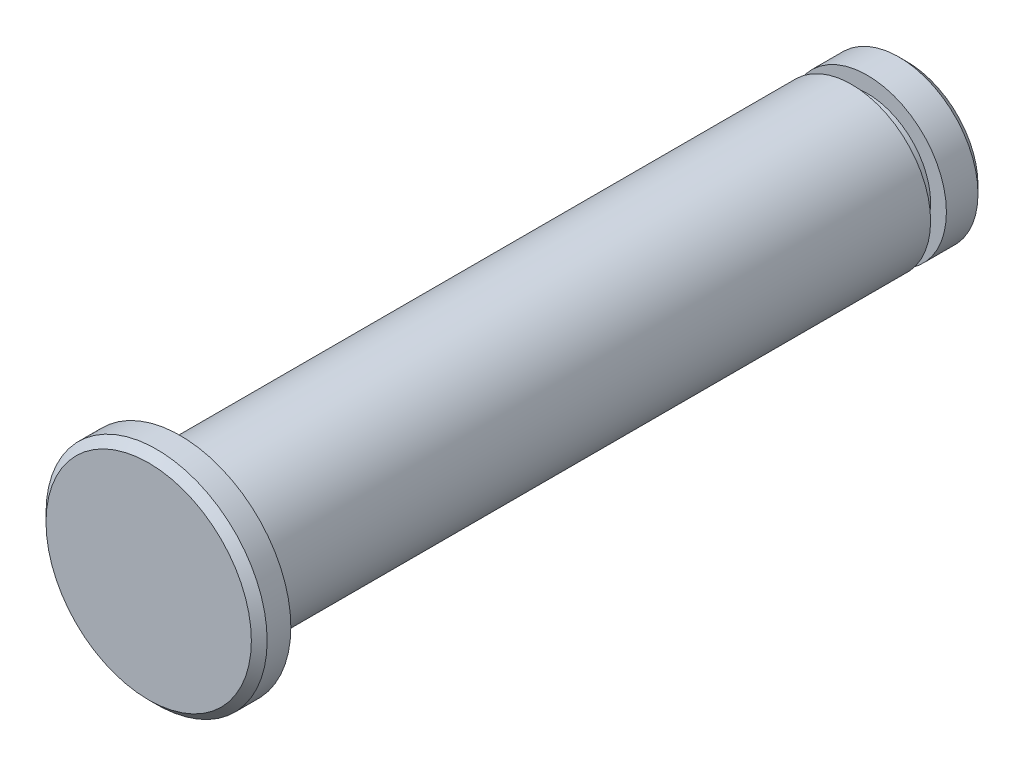
ISO-10303-21;
HEADER;
FILE_DESCRIPTION(('STEP AP214'),'2;1');
FILE_NAME('part.step','',(''),(''),'','','');
FILE_SCHEMA(('AUTOMOTIVE_DESIGN { 1 0 10303 214 1 1 1 1 }'));
ENDSEC;
DATA;
#1=APPLICATION_CONTEXT('core data for automotive mechanical design processes');
#2=APPLICATION_PROTOCOL_DEFINITION('international standard','automotive_design',2000,#1);
#3=PRODUCT_CONTEXT('',#1,'mechanical');
#4=PRODUCT('Part','Part','',(#3));
#5=PRODUCT_RELATED_PRODUCT_CATEGORY('part','',(#4));
#6=PRODUCT_DEFINITION_FORMATION('','',#4);
#7=PRODUCT_DEFINITION_CONTEXT('part definition',#1,'design');
#8=PRODUCT_DEFINITION('design','',#6,#7);
#9=PRODUCT_DEFINITION_SHAPE('','',#8);
#10=(LENGTH_UNIT() NAMED_UNIT(*) SI_UNIT(.MILLI.,.METRE.));
#11=(NAMED_UNIT(*) PLANE_ANGLE_UNIT() SI_UNIT($,.RADIAN.));
#12=(NAMED_UNIT(*) SI_UNIT($,.STERADIAN.) SOLID_ANGLE_UNIT());
#13=UNCERTAINTY_MEASURE_WITH_UNIT(LENGTH_MEASURE(1.E-05),#10,'distance_accuracy_value','');
#14=(GEOMETRIC_REPRESENTATION_CONTEXT(3) GLOBAL_UNCERTAINTY_ASSIGNED_CONTEXT((#13)) GLOBAL_UNIT_ASSIGNED_CONTEXT((#10,
#11,#12)) REPRESENTATION_CONTEXT('',''));
#15=CARTESIAN_POINT('',(0.,0.,0.));
#16=DIRECTION('',(0.,0.,1.));
#17=DIRECTION('',(1.,0.,0.));
#18=AXIS2_PLACEMENT_3D('',#15,#16,#17);
#19=CARTESIAN_POINT('',(0.,0.,46.));
#20=DIRECTION('',(0.,0.,-1.));
#21=DIRECTION('',(-1.,0.,0.));
#22=AXIS2_PLACEMENT_3D('',#19,#20,#21);
#23=CYLINDRICAL_SURFACE('',#22,5.);
#24=CARTESIAN_POINT('',(0.,0.,3.5));
#25=DIRECTION('',(0.,0.,1.));
#26=DIRECTION('',(1.,0.,0.));
#27=AXIS2_PLACEMENT_3D('',#24,#25,#26);
#28=CIRCLE('',#27,5.);
#29=CARTESIAN_POINT('',(5.,0.,3.5));
#30=VERTEX_POINT('',#29);
#31=EDGE_CURVE('E46',#30,#30,#28,.T.);
#32=ORIENTED_EDGE('',*,*,#31,.T.);
#33=EDGE_LOOP('',(#32));
#34=FACE_BOUND('',#33,.T.);
#35=CARTESIAN_POINT('',(0.,0.,46.));
#36=DIRECTION('',(0.,0.,1.));
#37=DIRECTION('',(1.,0.,0.));
#38=AXIS2_PLACEMENT_3D('',#35,#36,#37);
#39=CIRCLE('',#38,5.);
#40=CARTESIAN_POINT('',(5.,0.,46.));
#41=VERTEX_POINT('',#40);
#42=EDGE_CURVE('E82',#41,#41,#39,.T.);
#43=ORIENTED_EDGE('',*,*,#42,.F.);
#44=EDGE_LOOP('',(#43));
#45=FACE_BOUND('',#44,.T.);
#46=ADVANCED_FACE('F42',(#34,#45),#23,.T.);
#47=CARTESIAN_POINT('',(0.,0.,48.));
#48=DIRECTION('',(0.,0.,-1.));
#49=DIRECTION('',(-1.,0.,0.));
#50=AXIS2_PLACEMENT_3D('',#47,#48,#49);
#51=CYLINDRICAL_SURFACE('',#50,7.);
#52=CARTESIAN_POINT('',(0.,0.,47.5));
#53=DIRECTION('',(0.,0.,1.));
#54=DIRECTION('',(1.,0.,0.));
#55=AXIS2_PLACEMENT_3D('',#52,#53,#54);
#56=CIRCLE('',#55,7.);
#57=CARTESIAN_POINT('',(7.,0.,47.5));
#58=VERTEX_POINT('',#57);
#59=EDGE_CURVE('E57',#58,#58,#56,.F.);
#60=ORIENTED_EDGE('',*,*,#59,.T.);
#61=EDGE_LOOP('',(#60));
#62=FACE_BOUND('',#61,.T.);
#63=CARTESIAN_POINT('',(0.,0.,46.));
#64=DIRECTION('',(0.,0.,1.));
#65=DIRECTION('',(1.,0.,0.));
#66=AXIS2_PLACEMENT_3D('',#63,#64,#65);
#67=CIRCLE('',#66,7.);
#68=CARTESIAN_POINT('',(7.,0.,46.));
#69=VERTEX_POINT('',#68);
#70=EDGE_CURVE('E69',#69,#69,#67,.T.);
#71=ORIENTED_EDGE('',*,*,#70,.T.);
#72=EDGE_LOOP('',(#71));
#73=FACE_BOUND('',#72,.T.);
#74=ADVANCED_FACE('F93',(#62,#73),#51,.T.);
#75=CARTESIAN_POINT('',(0.,0.,48.));
#76=DIRECTION('',(0.,0.,1.));
#77=DIRECTION('',(1.,0.,0.));
#78=AXIS2_PLACEMENT_3D('',#75,#76,#77);
#79=PLANE('',#78);
#80=CARTESIAN_POINT('',(0.,0.,48.));
#81=DIRECTION('',(0.,0.,1.));
#82=DIRECTION('',(1.,0.,0.));
#83=AXIS2_PLACEMENT_3D('',#80,#81,#82);
#84=CIRCLE('',#83,6.50000000000001);
#85=CARTESIAN_POINT('',(6.50000000000001,0.,48.));
#86=VERTEX_POINT('',#85);
#87=EDGE_CURVE('E86',#86,#86,#84,.T.);
#88=ORIENTED_EDGE('',*,*,#87,.T.);
#89=EDGE_LOOP('',(#88));
#90=FACE_BOUND('',#89,.T.);
#91=ADVANCED_FACE('F103',(#90),#79,.T.);
#92=CARTESIAN_POINT('',(0.,0.,46.));
#93=DIRECTION('',(0.,0.,1.));
#94=DIRECTION('',(1.,0.,0.));
#95=AXIS2_PLACEMENT_3D('',#92,#93,#94);
#96=PLANE('',#95);
#97=ORIENTED_EDGE('',*,*,#42,.T.);
#98=EDGE_LOOP('',(#97));
#99=FACE_BOUND('',#98,.T.);
#100=ORIENTED_EDGE('',*,*,#70,.F.);
#101=EDGE_LOOP('',(#100));
#102=FACE_BOUND('',#101,.T.);
#103=ADVANCED_FACE('F100',(#99,#102),#96,.F.);
#104=CARTESIAN_POINT('',(0.,0.,48.));
#105=DIRECTION('',(0.,0.,-1.));
#106=DIRECTION('',(-1.,0.,0.));
#107=AXIS2_PLACEMENT_3D('',#104,#105,#106);
#108=CONICAL_SURFACE('',#107,6.50000000000001,0.785398163397442);
#109=ORIENTED_EDGE('',*,*,#59,.F.);
#110=EDGE_LOOP('',(#109));
#111=FACE_BOUND('',#110,.T.);
#112=ORIENTED_EDGE('',*,*,#87,.F.);
#113=EDGE_LOOP('',(#112));
#114=FACE_BOUND('',#113,.T.);
#115=ADVANCED_FACE('F96',(#111,#114),#108,.T.);
#116=CARTESIAN_POINT('',(0.,0.,3.5));
#117=DIRECTION('',(0.,0.,1.));
#118=DIRECTION('',(1.,0.,0.));
#119=AXIS2_PLACEMENT_3D('',#116,#117,#118);
#120=PLANE('',#119);
#121=CARTESIAN_POINT('',(0.,0.,3.5));
#122=DIRECTION('',(0.,0.,1.));
#123=DIRECTION('',(1.,0.,0.));
#124=AXIS2_PLACEMENT_3D('',#121,#122,#123);
#125=CIRCLE('',#124,4.);
#126=CARTESIAN_POINT('',(4.,0.,3.5));
#127=VERTEX_POINT('',#126);
#128=EDGE_CURVE('E63',#127,#127,#125,.T.);
#129=ORIENTED_EDGE('',*,*,#128,.T.);
#130=EDGE_LOOP('',(#129));
#131=FACE_BOUND('',#130,.T.);
#132=ORIENTED_EDGE('',*,*,#31,.F.);
#133=EDGE_LOOP('',(#132));
#134=FACE_BOUND('',#133,.T.);
#135=ADVANCED_FACE('F99',(#131,#134),#120,.F.);
#136=CARTESIAN_POINT('',(0.,0.,2.5));
#137=DIRECTION('',(0.,0.,1.));
#138=DIRECTION('',(1.,0.,0.));
#139=AXIS2_PLACEMENT_3D('',#136,#137,#138);
#140=PLANE('',#139);
#141=CARTESIAN_POINT('',(0.,0.,2.5));
#142=DIRECTION('',(0.,0.,1.));
#143=DIRECTION('',(1.,0.,0.));
#144=AXIS2_PLACEMENT_3D('',#141,#142,#143);
#145=CIRCLE('',#144,4.);
#146=CARTESIAN_POINT('',(4.,0.,2.5));
#147=VERTEX_POINT('',#146);
#148=EDGE_CURVE('E71',#147,#147,#145,.T.);
#149=ORIENTED_EDGE('',*,*,#148,.F.);
#150=EDGE_LOOP('',(#149));
#151=FACE_BOUND('',#150,.T.);
#152=CARTESIAN_POINT('',(0.,0.,2.5));
#153=DIRECTION('',(0.,0.,1.));
#154=DIRECTION('',(1.,0.,0.));
#155=AXIS2_PLACEMENT_3D('',#152,#153,#154);
#156=CIRCLE('',#155,5.);
#157=CARTESIAN_POINT('',(5.,0.,2.5));
#158=VERTEX_POINT('',#157);
#159=EDGE_CURVE('E60',#158,#158,#156,.T.);
#160=ORIENTED_EDGE('',*,*,#159,.T.);
#161=EDGE_LOOP('',(#160));
#162=FACE_BOUND('',#161,.T.);
#163=ADVANCED_FACE('F142',(#151,#162),#140,.T.);
#164=CARTESIAN_POINT('',(0.,0.,3.5));
#165=DIRECTION('',(0.,0.,-1.));
#166=DIRECTION('',(-1.,0.,0.));
#167=AXIS2_PLACEMENT_3D('',#164,#165,#166);
#168=CYLINDRICAL_SURFACE('',#167,4.);
#169=ORIENTED_EDGE('',*,*,#128,.F.);
#170=EDGE_LOOP('',(#169));
#171=FACE_BOUND('',#170,.T.);
#172=ORIENTED_EDGE('',*,*,#148,.T.);
#173=EDGE_LOOP('',(#172));
#174=FACE_BOUND('',#173,.T.);
#175=ADVANCED_FACE('F138',(#171,#174),#168,.T.);
#176=CARTESIAN_POINT('',(0.,0.,0.));
#177=DIRECTION('',(0.,0.,1.));
#178=DIRECTION('',(1.,0.,0.));
#179=AXIS2_PLACEMENT_3D('',#176,#177,#178);
#180=PLANE('',#179);
#181=CARTESIAN_POINT('',(0.,0.,0.));
#182=DIRECTION('',(0.,0.,1.));
#183=DIRECTION('',(1.,0.,0.));
#184=AXIS2_PLACEMENT_3D('',#181,#182,#183);
#185=CIRCLE('',#184,4.49999999999999);
#186=CARTESIAN_POINT('',(4.49999999999999,0.,0.));
#187=VERTEX_POINT('',#186);
#188=EDGE_CURVE('E11',#187,#187,#185,.F.);
#189=ORIENTED_EDGE('',*,*,#188,.T.);
#190=EDGE_LOOP('',(#189));
#191=FACE_BOUND('',#190,.T.);
#192=ADVANCED_FACE('F130',(#191),#180,.F.);
#193=CARTESIAN_POINT('',(0.,0.,0.500000000000007));
#194=DIRECTION('',(0.,0.,1.));
#195=DIRECTION('',(1.,0.,0.));
#196=AXIS2_PLACEMENT_3D('',#193,#194,#195);
#197=CONICAL_SURFACE('',#196,5.,0.78539816339745);
#198=ORIENTED_EDGE('',*,*,#188,.F.);
#199=EDGE_LOOP('',(#198));
#200=FACE_BOUND('',#199,.T.);
#201=CARTESIAN_POINT('',(0.,0.,0.500000000000007));
#202=DIRECTION('',(0.,0.,1.));
#203=DIRECTION('',(1.,0.,0.));
#204=AXIS2_PLACEMENT_3D('',#201,#202,#203);
#205=CIRCLE('',#204,5.);
#206=CARTESIAN_POINT('',(5.,0.,0.500000000000007));
#207=VERTEX_POINT('',#206);
#208=EDGE_CURVE('E51',#207,#207,#205,.T.);
#209=ORIENTED_EDGE('',*,*,#208,.F.);
#210=EDGE_LOOP('',(#209));
#211=FACE_BOUND('',#210,.T.);
#212=ADVANCED_FACE('F44',(#200,#211),#197,.T.);
#213=ORIENTED_EDGE('',*,*,#208,.T.);
#214=EDGE_LOOP('',(#213));
#215=FACE_BOUND('',#214,.T.);
#216=ORIENTED_EDGE('',*,*,#159,.F.);
#217=EDGE_LOOP('',(#216));
#218=FACE_BOUND('',#217,.T.);
#219=ADVANCED_FACE('F117',(#215,#218),#23,.T.);
#220=CLOSED_SHELL('',(#46,#74,#91,#103,#115,#135,#163,#175,#192,#212,#219));
#221=MANIFOLD_SOLID_BREP('B2',#220);
#222=ADVANCED_BREP_SHAPE_REPRESENTATION('',(#18,#221),#14);
#223=SHAPE_DEFINITION_REPRESENTATION(#9,#222);
ENDSEC;
END-ISO-10303-21;
